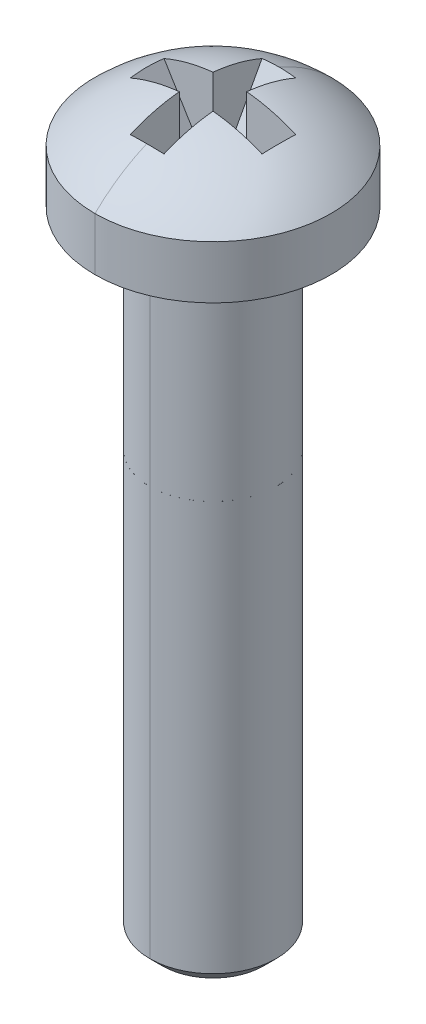
ISO-10303-21;
HEADER;
FILE_DESCRIPTION(('STEP AP214'),'2;1');
FILE_NAME('part.step','',(''),(''),'','','');
FILE_SCHEMA(('AUTOMOTIVE_DESIGN { 1 0 10303 214 1 1 1 1 }'));
ENDSEC;
DATA;
#1=APPLICATION_CONTEXT('core data for automotive mechanical design processes');
#2=APPLICATION_PROTOCOL_DEFINITION('international standard','automotive_design',2000,#1);
#3=PRODUCT_CONTEXT('',#1,'mechanical');
#4=PRODUCT('Part','Part','',(#3));
#5=PRODUCT_RELATED_PRODUCT_CATEGORY('part','',(#4));
#6=PRODUCT_DEFINITION_FORMATION('','',#4);
#7=PRODUCT_DEFINITION_CONTEXT('part definition',#1,'design');
#8=PRODUCT_DEFINITION('design','',#6,#7);
#9=PRODUCT_DEFINITION_SHAPE('','',#8);
#10=(LENGTH_UNIT() NAMED_UNIT(*) SI_UNIT(.MILLI.,.METRE.));
#11=(NAMED_UNIT(*) PLANE_ANGLE_UNIT() SI_UNIT($,.RADIAN.));
#12=(NAMED_UNIT(*) SI_UNIT($,.STERADIAN.) SOLID_ANGLE_UNIT());
#13=UNCERTAINTY_MEASURE_WITH_UNIT(LENGTH_MEASURE(1.E-05),#10,'distance_accuracy_value','');
#14=(GEOMETRIC_REPRESENTATION_CONTEXT(3) GLOBAL_UNCERTAINTY_ASSIGNED_CONTEXT((#13)) GLOBAL_UNIT_ASSIGNED_CONTEXT((#10,
#11,#12)) REPRESENTATION_CONTEXT('',''));
#15=CARTESIAN_POINT('',(0.,0.,0.));
#16=DIRECTION('',(0.,0.,1.));
#17=DIRECTION('',(1.,0.,0.));
#18=AXIS2_PLACEMENT_3D('',#15,#16,#17);
#19=CARTESIAN_POINT('',(0.,-15.,0.));
#20=DIRECTION('',(0.,-1.,0.));
#21=DIRECTION('',(0.,0.,-1.));
#22=AXIS2_PLACEMENT_3D('',#19,#20,#21);
#23=PLANE('',#22);
#24=CARTESIAN_POINT('',(0.,-15.,0.));
#25=DIRECTION('',(0.,-1.,0.));
#26=DIRECTION('',(0.,0.,-1.));
#27=AXIS2_PLACEMENT_3D('',#24,#25,#26);
#28=CIRCLE('',#27,1.2);
#29=CARTESIAN_POINT('',(0.,-15.,-1.2));
#30=VERTEX_POINT('',#29);
#31=CARTESIAN_POINT('',(0.,-15.,1.2));
#32=VERTEX_POINT('',#31);
#33=EDGE_CURVE('P0_E11',#30,#32,#28,.T.);
#34=ORIENTED_EDGE('',*,*,#33,.T.);
#35=CARTESIAN_POINT('',(0.,-15.,0.));
#36=DIRECTION('',(0.,1.,0.));
#37=DIRECTION('',(0.,0.,-1.));
#38=AXIS2_PLACEMENT_3D('',#35,#36,#37);
#39=CIRCLE('',#38,1.2);
#40=EDGE_CURVE('P0_E460',#30,#32,#39,.T.);
#41=ORIENTED_EDGE('',*,*,#40,.F.);
#42=EDGE_LOOP('',(#34,#41));
#43=FACE_BOUND('',#42,.T.);
#44=ADVANCED_FACE('P0_F17',(#43),#23,.T.);
#45=CARTESIAN_POINT('',(0.,-14.85,0.));
#46=DIRECTION('',(0.,1.,0.));
#47=DIRECTION('',(0.,0.,-1.));
#48=AXIS2_PLACEMENT_3D('',#45,#46,#47);
#49=CONICAL_SURFACE('',#48,1.35,0.7853981633973);
#50=CARTESIAN_POINT('',(0.,-14.7,0.));
#51=DIRECTION('',(0.,-1.,0.));
#52=DIRECTION('',(0.,0.,-1.));
#53=AXIS2_PLACEMENT_3D('',#50,#51,#52);
#54=CIRCLE('',#53,1.5);
#55=CARTESIAN_POINT('',(0.,-14.7,-1.5));
#56=VERTEX_POINT('',#55);
#57=CARTESIAN_POINT('',(0.,-14.7,1.5));
#58=VERTEX_POINT('',#57);
#59=EDGE_CURVE('P0_E414',#56,#58,#54,.T.);
#60=ORIENTED_EDGE('',*,*,#59,.T.);
#61=DIRECTION('',(0.,0.707106781186498,0.707106781186598));
#62=VECTOR('',#61,1.);
#63=CARTESIAN_POINT('',(0.,-15.,1.2));
#64=LINE('',#63,#62);
#65=EDGE_CURVE('P0_E463',#32,#58,#64,.T.);
#66=ORIENTED_EDGE('',*,*,#65,.F.);
#67=ORIENTED_EDGE('',*,*,#33,.F.);
#68=DIRECTION('',(0.,0.707106781186498,-0.707106781186598));
#69=VECTOR('',#68,1.);
#70=CARTESIAN_POINT('',(0.,-15.,-1.2));
#71=LINE('',#70,#69);
#72=EDGE_CURVE('P0_E20',#30,#56,#71,.T.);
#73=ORIENTED_EDGE('',*,*,#72,.T.);
#74=EDGE_LOOP('',(#60,#66,#67,#73));
#75=FACE_BOUND('',#74,.T.);
#76=ADVANCED_FACE('P0_F471',(#75),#49,.T.);
#77=CARTESIAN_POINT('',(0.,-14.85,0.));
#78=DIRECTION('',(0.,1.,0.));
#79=DIRECTION('',(0.,0.,-1.));
#80=AXIS2_PLACEMENT_3D('',#77,#78,#79);
#81=CONICAL_SURFACE('',#80,1.35,0.7853981633973);
#82=ORIENTED_EDGE('',*,*,#40,.T.);
#83=ORIENTED_EDGE('',*,*,#65,.T.);
#84=CARTESIAN_POINT('',(0.,-14.7,0.));
#85=DIRECTION('',(0.,1.,0.));
#86=DIRECTION('',(0.,0.,-1.));
#87=AXIS2_PLACEMENT_3D('',#84,#85,#86);
#88=CIRCLE('',#87,1.5);
#89=EDGE_CURVE('P0_E456',#56,#58,#88,.T.);
#90=ORIENTED_EDGE('',*,*,#89,.F.);
#91=ORIENTED_EDGE('',*,*,#72,.F.);
#92=EDGE_LOOP('',(#82,#83,#90,#91));
#93=FACE_BOUND('',#92,.T.);
#94=ADVANCED_FACE('P0_F475',(#93),#81,.T.);
#95=CARTESIAN_POINT('',(0.,3.27,0.));
#96=DIRECTION('',(0.,-1.,0.));
#97=DIRECTION('',(0.,0.,1.));
#98=AXIS2_PLACEMENT_3D('',#95,#96,#97);
#99=CYLINDRICAL_SURFACE('',#98,1.5);
#100=ORIENTED_EDGE('',*,*,#89,.T.);
#101=DIRECTION('',(0.,1.,0.));
#102=VECTOR('',#101,1.);
#103=CARTESIAN_POINT('',(0.,-14.7,1.5));
#104=LINE('',#103,#102);
#105=CARTESIAN_POINT('',(0.,0.,1.5));
#106=VERTEX_POINT('',#105);
#107=EDGE_CURVE('P0_E419',#58,#106,#104,.T.);
#108=ORIENTED_EDGE('',*,*,#107,.T.);
#109=CARTESIAN_POINT('',(0.,0.,0.));
#110=DIRECTION('',(0.,1.,0.));
#111=DIRECTION('',(0.,0.,-1.));
#112=AXIS2_PLACEMENT_3D('',#109,#110,#111);
#113=CIRCLE('',#112,1.5);
#114=CARTESIAN_POINT('',(0.,0.,-1.5));
#115=VERTEX_POINT('',#114);
#116=EDGE_CURVE('P0_E438',#115,#106,#113,.T.);
#117=ORIENTED_EDGE('',*,*,#116,.F.);
#118=DIRECTION('',(0.,1.,0.));
#119=VECTOR('',#118,1.);
#120=CARTESIAN_POINT('',(0.,-14.7,-1.5));
#121=LINE('',#120,#119);
#122=EDGE_CURVE('P0_E418',#56,#115,#121,.T.);
#123=ORIENTED_EDGE('',*,*,#122,.F.);
#124=EDGE_LOOP('',(#100,#108,#117,#123));
#125=FACE_BOUND('',#124,.T.);
#126=ADVANCED_FACE('P0_F478',(#125),#99,.T.);
#127=CARTESIAN_POINT('',(0.,3.27,0.));
#128=DIRECTION('',(0.,-1.,0.));
#129=DIRECTION('',(0.,0.,1.));
#130=AXIS2_PLACEMENT_3D('',#127,#128,#129);
#131=CYLINDRICAL_SURFACE('',#130,1.5);
#132=CARTESIAN_POINT('',(0.,0.,0.));
#133=DIRECTION('',(0.,-1.,0.));
#134=DIRECTION('',(0.,0.,-1.));
#135=AXIS2_PLACEMENT_3D('',#132,#133,#134);
#136=CIRCLE('',#135,1.5);
#137=EDGE_CURVE('P0_E434',#115,#106,#136,.T.);
#138=ORIENTED_EDGE('',*,*,#137,.T.);
#139=ORIENTED_EDGE('',*,*,#107,.F.);
#140=ORIENTED_EDGE('',*,*,#59,.F.);
#141=ORIENTED_EDGE('',*,*,#122,.T.);
#142=EDGE_LOOP('',(#138,#139,#140,#141));
#143=FACE_BOUND('',#142,.T.);
#144=ADVANCED_FACE('P0_F481',(#143),#131,.T.);
#145=CARTESIAN_POINT('',(0.,0.,0.));
#146=DIRECTION('',(0.,-1.,0.));
#147=DIRECTION('',(0.,0.,-1.));
#148=AXIS2_PLACEMENT_3D('',#145,#146,#147);
#149=PLANE('',#148);
#150=ORIENTED_EDGE('',*,*,#116,.T.);
#151=ORIENTED_EDGE('',*,*,#137,.F.);
#152=EDGE_LOOP('',(#150,#151));
#153=FACE_BOUND('',#152,.T.);
#154=CARTESIAN_POINT('',(0.,0.,0.));
#155=DIRECTION('',(0.,-1.,0.));
#156=DIRECTION('',(0.,0.,-1.));
#157=AXIS2_PLACEMENT_3D('',#154,#155,#156);
#158=CIRCLE('',#157,2.8);
#159=CARTESIAN_POINT('',(0.,0.,-2.8));
#160=VERTEX_POINT('',#159);
#161=CARTESIAN_POINT('',(0.,0.,2.8));
#162=VERTEX_POINT('',#161);
#163=EDGE_CURVE('P0_E446',#160,#162,#158,.T.);
#164=ORIENTED_EDGE('',*,*,#163,.T.);
#165=CARTESIAN_POINT('',(0.,0.,0.));
#166=DIRECTION('',(0.,1.,0.));
#167=DIRECTION('',(0.,0.,-1.));
#168=AXIS2_PLACEMENT_3D('',#165,#166,#167);
#169=CIRCLE('',#168,2.8);
#170=EDGE_CURVE('P0_E347',#160,#162,#169,.T.);
#171=ORIENTED_EDGE('',*,*,#170,.F.);
#172=EDGE_LOOP('',(#164,#171));
#173=FACE_BOUND('',#172,.T.);
#174=ADVANCED_FACE('P0_F483',(#153,#173),#149,.T.);
#175=CARTESIAN_POINT('',(0.,3.27,0.));
#176=DIRECTION('',(0.,-1.,0.));
#177=DIRECTION('',(0.,0.,1.));
#178=AXIS2_PLACEMENT_3D('',#175,#176,#177);
#179=CYLINDRICAL_SURFACE('',#178,2.8);
#180=CARTESIAN_POINT('',(0.,1.256571371417,0.));
#181=DIRECTION('',(0.,-1.,0.));
#182=DIRECTION('',(0.,0.,-1.));
#183=AXIS2_PLACEMENT_3D('',#180,#181,#182);
#184=CIRCLE('',#183,2.8);
#185=CARTESIAN_POINT('',(0.,1.256571371417,-2.8));
#186=VERTEX_POINT('',#185);
#187=CARTESIAN_POINT('',(0.,1.256571371417,2.8));
#188=VERTEX_POINT('',#187);
#189=EDGE_CURVE('P0_E241',#186,#188,#184,.T.);
#190=ORIENTED_EDGE('',*,*,#189,.T.);
#191=DIRECTION('',(0.,1.,0.));
#192=VECTOR('',#191,1.);
#193=CARTESIAN_POINT('',(0.,0.,2.8));
#194=LINE('',#193,#192);
#195=EDGE_CURVE('P0_E343',#162,#188,#194,.T.);
#196=ORIENTED_EDGE('',*,*,#195,.F.);
#197=ORIENTED_EDGE('',*,*,#163,.F.);
#198=DIRECTION('',(0.,1.,0.));
#199=VECTOR('',#198,1.);
#200=CARTESIAN_POINT('',(0.,0.,-2.8));
#201=LINE('',#200,#199);
#202=EDGE_CURVE('P0_E346',#160,#186,#201,.T.);
#203=ORIENTED_EDGE('',*,*,#202,.T.);
#204=EDGE_LOOP('',(#190,#196,#197,#203));
#205=FACE_BOUND('',#204,.T.);
#206=ADVANCED_FACE('P0_F486',(#205),#179,.T.);
#207=CARTESIAN_POINT('',(0.,3.27,0.));
#208=DIRECTION('',(0.,-1.,0.));
#209=DIRECTION('',(0.,0.,1.));
#210=AXIS2_PLACEMENT_3D('',#207,#208,#209);
#211=CYLINDRICAL_SURFACE('',#210,2.8);
#212=ORIENTED_EDGE('',*,*,#170,.T.);
#213=ORIENTED_EDGE('',*,*,#195,.T.);
#214=CARTESIAN_POINT('',(0.,1.256571371417,0.));
#215=DIRECTION('',(0.,1.,0.));
#216=DIRECTION('',(0.,0.,-1.));
#217=AXIS2_PLACEMENT_3D('',#214,#215,#216);
#218=CIRCLE('',#217,2.8);
#219=EDGE_CURVE('P0_E267',#186,#188,#218,.T.);
#220=ORIENTED_EDGE('',*,*,#219,.F.);
#221=ORIENTED_EDGE('',*,*,#202,.F.);
#222=EDGE_LOOP('',(#212,#213,#220,#221));
#223=FACE_BOUND('',#222,.T.);
#224=ADVANCED_FACE('P0_F496',(#223),#211,.T.);
#225=CARTESIAN_POINT('',(0.,0.,0.4));
#226=DIRECTION('',(0.,0.,1.));
#227=DIRECTION('',(1.,0.,0.));
#228=AXIS2_PLACEMENT_3D('',#225,#226,#227);
#229=PLANE('',#228);
#230=DIRECTION('',(0.,-1.,0.));
#231=VECTOR('',#230,1.);
#232=CARTESIAN_POINT('',(-0.4,2.359797974645,0.4));
#233=LINE('',#232,#231);
#234=CARTESIAN_POINT('',(-0.4,2.359797974645,0.4));
#235=VERTEX_POINT('',#234);
#236=CARTESIAN_POINT('',(-0.4,0.1594760794726,0.4));
#237=VERTEX_POINT('',#236);
#238=EDGE_CURVE('P0_E294',#235,#237,#233,.T.);
#239=ORIENTED_EDGE('',*,*,#238,.T.);
#240=DIRECTION('',(0.521313752334012,-0.853365086951319,0.));
#241=VECTOR('',#240,1.);
#242=CARTESIAN_POINT('',(-1.561519847402,2.060827196983,0.4));
#243=LINE('',#242,#241);
#244=CARTESIAN_POINT('',(-1.561519847402,2.060827196983,0.4));
#245=VERTEX_POINT('',#244);
#246=EDGE_CURVE('P0_E318',#245,#237,#243,.T.);
#247=ORIENTED_EDGE('',*,*,#246,.F.);
#248=CARTESIAN_POINT('',(0.,-1.6,0.4));
#249=DIRECTION('',(0.,0.,1.));
#250=DIRECTION('',(-0.100503781525898,0.994936676326184,0.));
#251=AXIS2_PLACEMENT_3D('',#248,#249,#250);
#252=CIRCLE('',#251,3.979949748426);
#253=EDGE_CURVE('P0_E387',#235,#245,#252,.T.);
#254=ORIENTED_EDGE('',*,*,#253,.F.);
#255=EDGE_LOOP('',(#239,#247,#254));
#256=FACE_BOUND('',#255,.T.);
#257=ADVANCED_FACE('P0_F512',(#256),#229,.F.);
#258=CARTESIAN_POINT('',(0.,0.,0.4));
#259=DIRECTION('',(0.,0.,1.));
#260=DIRECTION('',(1.,0.,0.));
#261=AXIS2_PLACEMENT_3D('',#258,#259,#260);
#262=PLANE('',#261);
#263=DIRECTION('',(1.,0.,0.));
#264=VECTOR('',#263,1.);
#265=CARTESIAN_POINT('',(-0.241488185187,-0.1,0.4));
#266=LINE('',#265,#264);
#267=CARTESIAN_POINT('',(-0.241488185187,-0.1,0.4));
#268=VERTEX_POINT('',#267);
#269=CARTESIAN_POINT('',(0.3855408748608,-0.1,0.4));
#270=VERTEX_POINT('',#269);
#271=EDGE_CURVE('P0_E431',#268,#270,#266,.T.);
#272=ORIENTED_EDGE('',*,*,#271,.F.);
#273=DIRECTION('',(0.521313752334012,-0.853365086951319,0.));
#274=VECTOR('',#273,1.);
#275=CARTESIAN_POINT('',(-0.4,0.1594760794726,0.4));
#276=LINE('',#275,#274);
#277=EDGE_CURVE('P0_E394',#237,#268,#276,.T.);
#278=ORIENTED_EDGE('',*,*,#277,.F.);
#279=DIRECTION('',(1.,0.,0.));
#280=VECTOR('',#279,1.);
#281=CARTESIAN_POINT('',(-0.4,0.1594760794726,0.4));
#282=LINE('',#281,#280);
#283=CARTESIAN_POINT('',(0.4,0.1594760794726,0.4));
#284=VERTEX_POINT('',#283);
#285=EDGE_CURVE('P0_E348',#237,#284,#282,.T.);
#286=ORIENTED_EDGE('',*,*,#285,.T.);
#287=DIRECTION('',(0.,-1.,0.));
#288=VECTOR('',#287,1.);
#289=CARTESIAN_POINT('',(0.4,2.359797974645,0.4));
#290=LINE('',#289,#288);
#291=CARTESIAN_POINT('',(0.4,2.359797974645,0.4));
#292=VERTEX_POINT('',#291);
#293=EDGE_CURVE('P0_E303',#292,#284,#290,.T.);
#294=ORIENTED_EDGE('',*,*,#293,.F.);
#295=CARTESIAN_POINT('',(0.,-1.6,0.4));
#296=DIRECTION('',(0.,0.,1.));
#297=DIRECTION('',(0.392579766011815,0.919717960745634,0.));
#298=AXIS2_PLACEMENT_3D('',#295,#296,#297);
#299=CIRCLE('',#298,3.979949748426);
#300=CARTESIAN_POINT('',(1.562447740976,2.060431266493,0.4));
#301=VERTEX_POINT('',#300);
#302=EDGE_CURVE('P0_E230',#301,#292,#299,.T.);
#303=ORIENTED_EDGE('',*,*,#302,.F.);
#304=DIRECTION('',(0.478378967835591,0.878153496339083,0.));
#305=VECTOR('',#304,1.);
#306=CARTESIAN_POINT('',(0.3855408748608,-0.1,0.4));
#307=LINE('',#306,#305);
#308=EDGE_CURVE('P0_E225',#270,#301,#307,.T.);
#309=ORIENTED_EDGE('',*,*,#308,.F.);
#310=EDGE_LOOP('',(#272,#278,#286,#294,#303,#309));
#311=FACE_BOUND('',#310,.T.);
#312=ADVANCED_FACE('P0_F566',(#311),#262,.F.);
#313=CARTESIAN_POINT('',(-0.4,2.078118441512,1.572082927268));
#314=DIRECTION('',(0.,-0.521313752334012,0.853365086951319));
#315=DIRECTION('',(-1.,0.,0.));
#316=AXIS2_PLACEMENT_3D('',#313,#314,#315);
#317=PLANE('',#316);
#318=DIRECTION('',(0.,-0.853365086951319,-0.521313752334012));
#319=VECTOR('',#318,1.);
#320=CARTESIAN_POINT('',(0.4,-0.07345758875551,0.2577027271379));
#321=LINE('',#320,#319);
#322=CARTESIAN_POINT('',(0.4,-0.07345758875551,0.2577027271379));
#323=VERTEX_POINT('',#322);
#324=CARTESIAN_POINT('',(0.4,-0.1,0.241488185187));
#325=VERTEX_POINT('',#324);
#326=EDGE_CURVE('P0_E322',#323,#325,#321,.T.);
#327=ORIENTED_EDGE('',*,*,#326,.T.);
#328=DIRECTION('',(1.,0.,0.));
#329=VECTOR('',#328,1.);
#330=CARTESIAN_POINT('',(0.3855408748608,-0.1,0.241488185187));
#331=LINE('',#330,#329);
#332=CARTESIAN_POINT('',(0.3855408748608,-0.1,0.241488185187));
#333=VERTEX_POINT('',#332);
#334=EDGE_CURVE('P0_E351',#333,#325,#331,.T.);
#335=ORIENTED_EDGE('',*,*,#334,.F.);
#336=DIRECTION('',(0.421551119413801,0.773835419800602,0.472729729108501));
#337=VECTOR('',#336,1.);
#338=CARTESIAN_POINT('',(0.3855408748608,-0.1,0.241488185187));
#339=LINE('',#338,#337);
#340=EDGE_CURVE('P0_E274',#333,#323,#339,.T.);
#341=ORIENTED_EDGE('',*,*,#340,.T.);
#342=EDGE_LOOP('',(#327,#335,#341));
#343=FACE_BOUND('',#342,.T.);
#344=ADVANCED_FACE('P0_F569',(#343),#317,.F.);
#345=CARTESIAN_POINT('',(-0.4,2.078118441512,1.572082927268));
#346=DIRECTION('',(0.,-0.521313752334012,0.853365086951319));
#347=DIRECTION('',(-1.,0.,0.));
#348=AXIS2_PLACEMENT_3D('',#345,#346,#347);
#349=PLANE('',#348);
#350=DIRECTION('',(1.,0.,0.));
#351=VECTOR('',#350,1.);
#352=CARTESIAN_POINT('',(-0.4,-0.1,0.241488185187));
#353=LINE('',#352,#351);
#354=CARTESIAN_POINT('',(-0.4,-0.1,0.241488185187));
#355=VERTEX_POINT('',#354);
#356=CARTESIAN_POINT('',(-0.241488185187,-0.1,0.241488185187));
#357=VERTEX_POINT('',#356);
#358=EDGE_CURVE('P0_E428',#355,#357,#353,.T.);
#359=ORIENTED_EDGE('',*,*,#358,.F.);
#360=DIRECTION('',(0.,-0.853365086951319,-0.521313752334012));
#361=VECTOR('',#360,1.);
#362=CARTESIAN_POINT('',(-0.4,0.1594760794726,0.4));
#363=LINE('',#362,#361);
#364=EDGE_CURVE('P0_E398',#237,#355,#363,.T.);
#365=ORIENTED_EDGE('',*,*,#364,.F.);
#366=DIRECTION('',(-0.462269489645205,0.756712519974609,0.462269489645205));
#367=VECTOR('',#366,1.);
#368=CARTESIAN_POINT('',(-0.241488185187,-0.1,0.241488185187));
#369=LINE('',#368,#367);
#370=EDGE_CURVE('P0_E406',#357,#237,#369,.T.);
#371=ORIENTED_EDGE('',*,*,#370,.F.);
#372=EDGE_LOOP('',(#359,#365,#371));
#373=FACE_BOUND('',#372,.T.);
#374=ADVANCED_FACE('P0_F571',(#373),#349,.F.);
#375=CARTESIAN_POINT('',(-0.4,2.078118441512,1.572082927268));
#376=DIRECTION('',(0.,-0.521313752334012,0.853365086951319));
#377=DIRECTION('',(-1.,0.,0.));
#378=AXIS2_PLACEMENT_3D('',#375,#376,#377);
#379=PLANE('',#378);
#380=DIRECTION('',(0.,-0.853365086951319,-0.521313752334012));
#381=VECTOR('',#380,1.);
#382=CARTESIAN_POINT('',(-0.4,2.060827196983,1.561519847402));
#383=LINE('',#382,#381);
#384=CARTESIAN_POINT('',(-0.4,2.060827196983,1.561519847402));
#385=VERTEX_POINT('',#384);
#386=EDGE_CURVE('P0_E290',#385,#237,#383,.T.);
#387=ORIENTED_EDGE('',*,*,#386,.F.);
#388=CARTESIAN_POINT('',(0.,-1.299779037149,-0.4914470161607));
#389=DIRECTION('',(0.,-0.521313752334012,0.853365086951319));
#390=DIRECTION('',(0.,0.853365086951319,0.521313752334012));
#391=AXIS2_PLACEMENT_3D('',#388,#389,#390);
#392=CIRCLE('',#391,3.958326313453);
#393=CARTESIAN_POINT('',(0.,2.078118441512,1.572082927268));
#394=VERTEX_POINT('',#393);
#395=EDGE_CURVE('P0_E262',#394,#385,#392,.T.);
#396=ORIENTED_EDGE('',*,*,#395,.F.);
#397=CARTESIAN_POINT('',(0.,-1.299779037149,-0.4914470161607));
#398=DIRECTION('',(0.,-0.521313752334015,0.853365086951317));
#399=DIRECTION('',(0.101052810790401,0.848996764796909,0.518645180056406));
#400=AXIS2_PLACEMENT_3D('',#397,#398,#399);
#401=CIRCLE('',#400,3.958326313453);
#402=CARTESIAN_POINT('',(0.4,2.060827196983,1.561519847402));
#403=VERTEX_POINT('',#402);
#404=EDGE_CURVE('P0_E261',#403,#394,#401,.T.);
#405=ORIENTED_EDGE('',*,*,#404,.F.);
#406=DIRECTION('',(0.,-0.853365086951319,-0.521313752334012));
#407=VECTOR('',#406,1.);
#408=CARTESIAN_POINT('',(0.4,2.060827196983,1.561519847402));
#409=LINE('',#408,#407);
#410=EDGE_CURVE('P0_E306',#403,#284,#409,.T.);
#411=ORIENTED_EDGE('',*,*,#410,.T.);
#412=ORIENTED_EDGE('',*,*,#285,.F.);
#413=EDGE_LOOP('',(#387,#396,#405,#411,#412));
#414=FACE_BOUND('',#413,.T.);
#415=ADVANCED_FACE('P0_F505',(#414),#379,.F.);
#416=CARTESIAN_POINT('',(-0.4,-0.1,0.241488185187));
#417=DIRECTION('',(0.,-1.,0.));
#418=DIRECTION('',(0.,0.,-1.));
#419=AXIS2_PLACEMENT_3D('',#416,#417,#418);
#420=PLANE('',#419);
#421=DIRECTION('',(0.,0.,-1.));
#422=VECTOR('',#421,1.);
#423=CARTESIAN_POINT('',(-0.4,-0.1,0.241488185187));
#424=LINE('',#423,#422);
#425=CARTESIAN_POINT('',(-0.4,-0.1,-0.3855408748608));
#426=VERTEX_POINT('',#425);
#427=EDGE_CURVE('P0_E295',#355,#426,#424,.T.);
#428=ORIENTED_EDGE('',*,*,#427,.F.);
#429=ORIENTED_EDGE('',*,*,#358,.T.);
#430=DIRECTION('',(0.,0.,1.));
#431=VECTOR('',#430,1.);
#432=CARTESIAN_POINT('',(-0.241488185187,-0.1,0.241488185187));
#433=LINE('',#432,#431);
#434=EDGE_CURVE('P0_E402',#357,#268,#433,.T.);
#435=ORIENTED_EDGE('',*,*,#434,.T.);
#436=ORIENTED_EDGE('',*,*,#271,.T.);
#437=DIRECTION('',(0.,0.,1.));
#438=VECTOR('',#437,1.);
#439=CARTESIAN_POINT('',(0.3855408748608,-0.1,0.241488185187));
#440=LINE('',#439,#438);
#441=EDGE_CURVE('P0_E277',#333,#270,#440,.T.);
#442=ORIENTED_EDGE('',*,*,#441,.F.);
#443=ORIENTED_EDGE('',*,*,#334,.T.);
#444=DIRECTION('',(0.,0.,-1.));
#445=VECTOR('',#444,1.);
#446=CARTESIAN_POINT('',(0.4,-0.1,0.241488185187));
#447=LINE('',#446,#445);
#448=CARTESIAN_POINT('',(0.4,-0.1,-0.3855408748608));
#449=VERTEX_POINT('',#448);
#450=EDGE_CURVE('P0_E302',#325,#449,#447,.T.);
#451=ORIENTED_EDGE('',*,*,#450,.T.);
#452=DIRECTION('',(1.,0.,0.));
#453=VECTOR('',#452,1.);
#454=CARTESIAN_POINT('',(0.3855408748608,-0.1,-0.3855408748608));
#455=LINE('',#454,#453);
#456=CARTESIAN_POINT('',(0.3855408748608,-0.1,-0.3855408748608));
#457=VERTEX_POINT('',#456);
#458=EDGE_CURVE('P0_E381',#457,#449,#455,.T.);
#459=ORIENTED_EDGE('',*,*,#458,.F.);
#460=DIRECTION('',(0.,0.,1.));
#461=VECTOR('',#460,1.);
#462=CARTESIAN_POINT('',(0.3855408748608,-0.1,-0.4));
#463=LINE('',#462,#461);
#464=CARTESIAN_POINT('',(0.3855408748608,-0.1,-0.4));
#465=VERTEX_POINT('',#464);
#466=EDGE_CURVE('P0_E355',#465,#457,#463,.T.);
#467=ORIENTED_EDGE('',*,*,#466,.F.);
#468=DIRECTION('',(1.,0.,0.));
#469=VECTOR('',#468,1.);
#470=CARTESIAN_POINT('',(-0.241488185187,-0.1,-0.4));
#471=LINE('',#470,#469);
#472=CARTESIAN_POINT('',(-0.241488185187,-0.1,-0.4));
#473=VERTEX_POINT('',#472);
#474=EDGE_CURVE('P0_E286',#473,#465,#471,.T.);
#475=ORIENTED_EDGE('',*,*,#474,.F.);
#476=DIRECTION('',(0.,0.,1.));
#477=VECTOR('',#476,1.);
#478=CARTESIAN_POINT('',(-0.241488185187,-0.1,-0.4));
#479=LINE('',#478,#477);
#480=CARTESIAN_POINT('',(-0.241488185187,-0.1,-0.3855408748608));
#481=VERTEX_POINT('',#480);
#482=EDGE_CURVE('P0_E374',#473,#481,#479,.T.);
#483=ORIENTED_EDGE('',*,*,#482,.T.);
#484=DIRECTION('',(1.,0.,0.));
#485=VECTOR('',#484,1.);
#486=CARTESIAN_POINT('',(-0.4,-0.1,-0.3855408748608));
#487=LINE('',#486,#485);
#488=EDGE_CURVE('P0_E370',#426,#481,#487,.T.);
#489=ORIENTED_EDGE('',*,*,#488,.F.);
#490=EDGE_LOOP('',(#428,#429,#435,#436,#442,#443,#451,#459,#467,#475,#483,#489));
#491=FACE_BOUND('',#490,.T.);
#492=ADVANCED_FACE('P0_F577',(#491),#420,.F.);
#493=CARTESIAN_POINT('',(-0.4,0.,0.));
#494=DIRECTION('',(1.,0.,0.));
#495=DIRECTION('',(0.,1.,0.));
#496=AXIS2_PLACEMENT_3D('',#493,#494,#495);
#497=PLANE('',#496);
#498=CARTESIAN_POINT('',(-0.4,-1.6,0.));
#499=DIRECTION('',(1.,0.,0.));
#500=DIRECTION('',(0.,0.994936676326184,0.100503781525898));
#501=AXIS2_PLACEMENT_3D('',#498,#499,#500);
#502=CIRCLE('',#501,3.979949748426);
#503=EDGE_CURVE('P0_E266',#235,#385,#502,.T.);
#504=ORIENTED_EDGE('',*,*,#503,.T.);
#505=ORIENTED_EDGE('',*,*,#386,.T.);
#506=ORIENTED_EDGE('',*,*,#238,.F.);
#507=EDGE_LOOP('',(#504,#505,#506));
#508=FACE_BOUND('',#507,.T.);
#509=ADVANCED_FACE('P0_F508',(#508),#497,.T.);
#510=CARTESIAN_POINT('',(-0.4,0.,0.));
#511=DIRECTION('',(1.,0.,0.));
#512=DIRECTION('',(0.,1.,0.));
#513=AXIS2_PLACEMENT_3D('',#510,#511,#512);
#514=PLANE('',#513);
#515=DIRECTION('',(0.,-1.,0.));
#516=VECTOR('',#515,1.);
#517=CARTESIAN_POINT('',(-0.4,2.359797974645,-0.4));
#518=LINE('',#517,#516);
#519=CARTESIAN_POINT('',(-0.4,2.359797974645,-0.4));
#520=VERTEX_POINT('',#519);
#521=CARTESIAN_POINT('',(-0.4,0.1594760794726,-0.4));
#522=VERTEX_POINT('',#521);
#523=EDGE_CURVE('P0_E257',#520,#522,#518,.T.);
#524=ORIENTED_EDGE('',*,*,#523,.T.);
#525=DIRECTION('',(0.,0.,1.));
#526=VECTOR('',#525,1.);
#527=CARTESIAN_POINT('',(-0.4,0.1594760794726,-0.4));
#528=LINE('',#527,#526);
#529=EDGE_CURVE('P0_E313',#522,#237,#528,.T.);
#530=ORIENTED_EDGE('',*,*,#529,.T.);
#531=ORIENTED_EDGE('',*,*,#364,.T.);
#532=ORIENTED_EDGE('',*,*,#427,.T.);
#533=DIRECTION('',(0.,0.878153496339083,-0.478378967835591));
#534=VECTOR('',#533,1.);
#535=CARTESIAN_POINT('',(-0.4,-0.1,-0.3855408748608));
#536=LINE('',#535,#534);
#537=CARTESIAN_POINT('',(-0.4,2.060431266493,-1.562447740976));
#538=VERTEX_POINT('',#537);
#539=EDGE_CURVE('P0_E366',#426,#538,#536,.T.);
#540=ORIENTED_EDGE('',*,*,#539,.T.);
#541=CARTESIAN_POINT('',(-0.4,-1.6,0.));
#542=DIRECTION('',(1.,0.,0.));
#543=DIRECTION('',(0.,0.919717960745634,-0.392579766011815));
#544=AXIS2_PLACEMENT_3D('',#541,#542,#543);
#545=CIRCLE('',#544,3.979949748426);
#546=EDGE_CURVE('P0_E395',#538,#520,#545,.T.);
#547=ORIENTED_EDGE('',*,*,#546,.T.);
#548=EDGE_LOOP('',(#524,#530,#531,#532,#540,#547));
#549=FACE_BOUND('',#548,.T.);
#550=ADVANCED_FACE('P0_F522',(#549),#514,.T.);
#551=CARTESIAN_POINT('',(0.,-1.6,0.));
#552=DIRECTION('',(0.,-1.,0.));
#553=DIRECTION('',(0.,0.,1.));
#554=AXIS2_PLACEMENT_3D('',#551,#552,#553);
#555=SPHERICAL_SURFACE('',#554,4.);
#556=CARTESIAN_POINT('',(0.,-1.418692273732,0.3328240253877));
#557=DIRECTION('',(0.,-0.478378967835579,-0.878153496339089));
#558=DIRECTION('',(-0.100451933816205,0.873711719002947,-0.475959285096426));
#559=AXIS2_PLACEMENT_3D('',#556,#557,#558);
#560=CIRCLE('',#559,3.982003977462);
#561=CARTESIAN_POINT('',(0.,2.078118441512,-1.572082927268));
#562=VERTEX_POINT('',#561);
#563=EDGE_CURVE('P0_E363',#538,#562,#560,.T.);
#564=ORIENTED_EDGE('',*,*,#563,.T.);
#565=CARTESIAN_POINT('',(0.,-1.6,0.));
#566=DIRECTION('',(1.,0.,0.));
#567=DIRECTION('',(0.,0.714142842854292,-0.7));
#568=AXIS2_PLACEMENT_3D('',#565,#566,#567);
#569=CIRCLE('',#568,4.);
#570=EDGE_CURVE('P0_E245',#186,#562,#569,.T.);
#571=ORIENTED_EDGE('',*,*,#570,.F.);
#572=ORIENTED_EDGE('',*,*,#219,.T.);
#573=CARTESIAN_POINT('',(0.,-1.6,0.));
#574=DIRECTION('',(-1.,0.,0.));
#575=DIRECTION('',(0.,0.714142842854292,0.7));
#576=AXIS2_PLACEMENT_3D('',#573,#574,#575);
#577=CIRCLE('',#576,4.);
#578=EDGE_CURVE('P0_E246',#188,#394,#577,.T.);
#579=ORIENTED_EDGE('',*,*,#578,.T.);
#580=ORIENTED_EDGE('',*,*,#395,.T.);
#581=ORIENTED_EDGE('',*,*,#503,.F.);
#582=ORIENTED_EDGE('',*,*,#253,.T.);
#583=CARTESIAN_POINT('',(0.4914470161607,-1.299779037149,0.));
#584=DIRECTION('',(0.853365086951317,0.521313752334015,0.));
#585=DIRECTION('',(-0.518645180056406,0.848996764796909,-0.101052810790401));
#586=AXIS2_PLACEMENT_3D('',#583,#584,#585);
#587=CIRCLE('',#586,3.958326313453);
#588=CARTESIAN_POINT('',(-1.561519847402,2.060827196983,-0.4));
#589=VERTEX_POINT('',#588);
#590=EDGE_CURVE('P0_E317',#589,#245,#587,.T.);
#591=ORIENTED_EDGE('',*,*,#590,.F.);
#592=CARTESIAN_POINT('',(0.,-1.6,-0.4));
#593=DIRECTION('',(0.,0.,1.));
#594=DIRECTION('',(-0.100503781525898,0.994936676326184,0.));
#595=AXIS2_PLACEMENT_3D('',#592,#593,#594);
#596=CIRCLE('',#595,3.979949748426);
#597=EDGE_CURVE('P0_E342',#520,#589,#596,.T.);
#598=ORIENTED_EDGE('',*,*,#597,.F.);
#599=ORIENTED_EDGE('',*,*,#546,.F.);
#600=EDGE_LOOP('',(#564,#571,#572,#579,#580,#581,#582,#591,#598,#599));
#601=FACE_BOUND('',#600,.T.);
#602=ADVANCED_FACE('P0_F499',(#601),#555,.T.);
#603=CARTESIAN_POINT('',(-1.572082927268,2.078118441512,-0.4));
#604=DIRECTION('',(-0.853365086951319,-0.521313752334012,0.));
#605=DIRECTION('',(-0.521313752334012,0.853365086951319,0.));
#606=AXIS2_PLACEMENT_3D('',#603,#604,#605);
#607=PLANE('',#606);
#608=ORIENTED_EDGE('',*,*,#482,.F.);
#609=DIRECTION('',(0.521313752334012,-0.853365086951319,0.));
#610=VECTOR('',#609,1.);
#611=CARTESIAN_POINT('',(-0.2577027271379,-0.07345758875551,-0.4));
#612=LINE('',#611,#610);
#613=CARTESIAN_POINT('',(-0.2577027271379,-0.07345758875551,-0.4));
#614=VERTEX_POINT('',#613);
#615=EDGE_CURVE('P0_E282',#614,#473,#612,.T.);
#616=ORIENTED_EDGE('',*,*,#615,.F.);
#617=DIRECTION('',(-0.472729729108501,0.773835419800602,-0.421551119413801));
#618=VECTOR('',#617,1.);
#619=CARTESIAN_POINT('',(-0.241488185187,-0.1,-0.3855408748608));
#620=LINE('',#619,#618);
#621=EDGE_CURVE('P0_E378',#481,#614,#620,.T.);
#622=ORIENTED_EDGE('',*,*,#621,.F.);
#623=EDGE_LOOP('',(#608,#616,#622));
#624=FACE_BOUND('',#623,.T.);
#625=ADVANCED_FACE('P0_F585',(#624),#607,.F.);
#626=CARTESIAN_POINT('',(-1.572082927268,2.078118441512,-0.4));
#627=DIRECTION('',(-0.853365086951319,-0.521313752334012,0.));
#628=DIRECTION('',(-0.521313752334012,0.853365086951319,0.));
#629=AXIS2_PLACEMENT_3D('',#626,#627,#628);
#630=PLANE('',#629);
#631=ORIENTED_EDGE('',*,*,#277,.T.);
#632=ORIENTED_EDGE('',*,*,#434,.F.);
#633=ORIENTED_EDGE('',*,*,#370,.T.);
#634=EDGE_LOOP('',(#631,#632,#633));
#635=FACE_BOUND('',#634,.T.);
#636=ADVANCED_FACE('P0_F588',(#635),#630,.F.);
#637=CARTESIAN_POINT('',(-1.572082927268,2.078118441512,-0.4));
#638=DIRECTION('',(-0.853365086951319,-0.521313752334012,0.));
#639=DIRECTION('',(-0.521313752334012,0.853365086951319,0.));
#640=AXIS2_PLACEMENT_3D('',#637,#638,#639);
#641=PLANE('',#640);
#642=ORIENTED_EDGE('',*,*,#246,.T.);
#643=ORIENTED_EDGE('',*,*,#529,.F.);
#644=DIRECTION('',(0.521313752334012,-0.853365086951319,0.));
#645=VECTOR('',#644,1.);
#646=CARTESIAN_POINT('',(-1.561519847402,2.060827196983,-0.4));
#647=LINE('',#646,#645);
#648=EDGE_CURVE('P0_E217',#589,#522,#647,.T.);
#649=ORIENTED_EDGE('',*,*,#648,.F.);
#650=ORIENTED_EDGE('',*,*,#590,.T.);
#651=EDGE_LOOP('',(#642,#643,#649,#650));
#652=FACE_BOUND('',#651,.T.);
#653=ADVANCED_FACE('P0_F516',(#652),#641,.F.);
#654=CARTESIAN_POINT('',(-0.4,-0.1,-0.3855408748608));
#655=DIRECTION('',(0.,-0.478378967835591,-0.878153496339083));
#656=DIRECTION('',(0.,-0.878153496339083,0.478378967835591));
#657=AXIS2_PLACEMENT_3D('',#654,#655,#656);
#658=PLANE('',#657);
#659=ORIENTED_EDGE('',*,*,#458,.T.);
#660=DIRECTION('',(0.,0.878153496339083,-0.478378967835591));
#661=VECTOR('',#660,1.);
#662=CARTESIAN_POINT('',(0.4,-0.1,-0.3855408748608));
#663=LINE('',#662,#661);
#664=CARTESIAN_POINT('',(0.4,-0.07345758875551,-0.4));
#665=VERTEX_POINT('',#664);
#666=EDGE_CURVE('P0_E298',#449,#665,#663,.T.);
#667=ORIENTED_EDGE('',*,*,#666,.T.);
#668=DIRECTION('',(0.431542198894386,0.792175902907174,-0.431542198894386));
#669=VECTOR('',#668,1.);
#670=CARTESIAN_POINT('',(0.3855408748608,-0.1,-0.3855408748608));
#671=LINE('',#670,#669);
#672=EDGE_CURVE('P0_E278',#457,#665,#671,.T.);
#673=ORIENTED_EDGE('',*,*,#672,.F.);
#674=EDGE_LOOP('',(#659,#667,#673));
#675=FACE_BOUND('',#674,.T.);
#676=ADVANCED_FACE('P0_F594',(#675),#658,.F.);
#677=CARTESIAN_POINT('',(-0.4,-0.1,-0.3855408748608));
#678=DIRECTION('',(0.,-0.478378967835591,-0.878153496339083));
#679=DIRECTION('',(0.,-0.878153496339083,0.478378967835591));
#680=AXIS2_PLACEMENT_3D('',#677,#678,#679);
#681=PLANE('',#680);
#682=DIRECTION('',(0.,0.878153496339083,-0.47837896783559));
#683=VECTOR('',#682,1.);
#684=CARTESIAN_POINT('',(0.4,-0.07345758875551,-0.4));
#685=LINE('',#684,#683);
#686=CARTESIAN_POINT('',(0.4,2.060431266493,-1.562447740976));
#687=VERTEX_POINT('',#686);
#688=EDGE_CURVE('P0_E249',#665,#687,#685,.T.);
#689=ORIENTED_EDGE('',*,*,#688,.T.);
#690=CARTESIAN_POINT('',(0.,-1.418692273732,0.3328240253877));
#691=DIRECTION('',(0.,-0.478378967835591,-0.878153496339083));
#692=DIRECTION('',(0.,0.878153496339083,-0.478378967835591));
#693=AXIS2_PLACEMENT_3D('',#690,#691,#692);
#694=CIRCLE('',#693,3.982003977462);
#695=EDGE_CURVE('P0_E250',#562,#687,#694,.T.);
#696=ORIENTED_EDGE('',*,*,#695,.F.);
#697=ORIENTED_EDGE('',*,*,#563,.F.);
#698=ORIENTED_EDGE('',*,*,#539,.F.);
#699=ORIENTED_EDGE('',*,*,#488,.T.);
#700=ORIENTED_EDGE('',*,*,#621,.T.);
#701=DIRECTION('',(1.,0.,0.));
#702=VECTOR('',#701,1.);
#703=CARTESIAN_POINT('',(-0.2577027271379,-0.07345758875551,-0.4));
#704=LINE('',#703,#702);
#705=EDGE_CURVE('P0_E287',#614,#665,#704,.T.);
#706=ORIENTED_EDGE('',*,*,#705,.T.);
#707=EDGE_LOOP('',(#689,#696,#697,#698,#699,#700,#706));
#708=FACE_BOUND('',#707,.T.);
#709=ADVANCED_FACE('P0_F526',(#708),#681,.F.);
#710=CARTESIAN_POINT('',(0.3855408748608,-0.1,-0.4));
#711=DIRECTION('',(0.878153496339083,-0.478378967835591,0.));
#712=DIRECTION('',(0.,0.,-1.));
#713=AXIS2_PLACEMENT_3D('',#710,#711,#712);
#714=PLANE('',#713);
#715=CARTESIAN_POINT('',(-0.3328240253877,-1.418692273732,0.));
#716=DIRECTION('',(-0.878153496339089,0.478378967835579,0.));
#717=DIRECTION('',(0.475959285096426,0.873711719002947,0.100451933816205));
#718=AXIS2_PLACEMENT_3D('',#715,#716,#717);
#719=CIRCLE('',#718,3.982003977462);
#720=CARTESIAN_POINT('',(1.562447740976,2.060431266493,-0.4));
#721=VERTEX_POINT('',#720);
#722=EDGE_CURVE('P0_E221',#301,#721,#719,.T.);
#723=ORIENTED_EDGE('',*,*,#722,.T.);
#724=DIRECTION('',(0.47837896783559,0.878153496339083,0.));
#725=VECTOR('',#724,1.);
#726=CARTESIAN_POINT('',(0.4,-0.07345758875551,-0.4));
#727=LINE('',#726,#725);
#728=EDGE_CURVE('P0_E206',#665,#721,#727,.T.);
#729=ORIENTED_EDGE('',*,*,#728,.F.);
#730=DIRECTION('',(0.,0.,1.));
#731=VECTOR('',#730,1.);
#732=CARTESIAN_POINT('',(0.4,-0.07345758875551,-0.4));
#733=LINE('',#732,#731);
#734=EDGE_CURVE('P0_E326',#665,#323,#733,.T.);
#735=ORIENTED_EDGE('',*,*,#734,.T.);
#736=ORIENTED_EDGE('',*,*,#340,.F.);
#737=ORIENTED_EDGE('',*,*,#441,.T.);
#738=ORIENTED_EDGE('',*,*,#308,.T.);
#739=EDGE_LOOP('',(#723,#729,#735,#736,#737,#738));
#740=FACE_BOUND('',#739,.T.);
#741=ADVANCED_FACE('P0_F222',(#740),#714,.F.);
#742=CARTESIAN_POINT('',(0.3855408748608,-0.1,-0.4));
#743=DIRECTION('',(0.878153496339083,-0.478378967835591,0.));
#744=DIRECTION('',(0.,0.,-1.));
#745=AXIS2_PLACEMENT_3D('',#742,#743,#744);
#746=PLANE('',#745);
#747=ORIENTED_EDGE('',*,*,#466,.T.);
#748=ORIENTED_EDGE('',*,*,#672,.T.);
#749=DIRECTION('',(0.478378967835591,0.878153496339083,0.));
#750=VECTOR('',#749,1.);
#751=CARTESIAN_POINT('',(0.3855408748608,-0.1,-0.4));
#752=LINE('',#751,#750);
#753=EDGE_CURVE('P0_E218',#465,#665,#752,.T.);
#754=ORIENTED_EDGE('',*,*,#753,.F.);
#755=EDGE_LOOP('',(#747,#748,#754));
#756=FACE_BOUND('',#755,.T.);
#757=ADVANCED_FACE('P0_F608',(#756),#746,.F.);
#758=CARTESIAN_POINT('',(0.,0.,-0.4));
#759=DIRECTION('',(0.,0.,1.));
#760=DIRECTION('',(1.,0.,0.));
#761=AXIS2_PLACEMENT_3D('',#758,#759,#760);
#762=PLANE('',#761);
#763=ORIENTED_EDGE('',*,*,#648,.T.);
#764=ORIENTED_EDGE('',*,*,#523,.F.);
#765=ORIENTED_EDGE('',*,*,#597,.T.);
#766=EDGE_LOOP('',(#763,#764,#765));
#767=FACE_BOUND('',#766,.T.);
#768=ADVANCED_FACE('P0_F519',(#767),#762,.T.);
#769=CARTESIAN_POINT('',(0.,0.,-0.4));
#770=DIRECTION('',(0.,0.,1.));
#771=DIRECTION('',(1.,0.,0.));
#772=AXIS2_PLACEMENT_3D('',#769,#770,#771);
#773=PLANE('',#772);
#774=DIRECTION('',(0.,-1.,0.));
#775=VECTOR('',#774,1.);
#776=CARTESIAN_POINT('',(0.4,2.359797974645,-0.4));
#777=LINE('',#776,#775);
#778=CARTESIAN_POINT('',(0.4,2.359797974645,-0.4));
#779=VERTEX_POINT('',#778);
#780=EDGE_CURVE('P0_E211',#779,#665,#777,.T.);
#781=ORIENTED_EDGE('',*,*,#780,.T.);
#782=ORIENTED_EDGE('',*,*,#728,.T.);
#783=CARTESIAN_POINT('',(0.,-1.6,-0.4));
#784=DIRECTION('',(0.,0.,1.));
#785=DIRECTION('',(0.392579766011815,0.919717960745634,0.));
#786=AXIS2_PLACEMENT_3D('',#783,#784,#785);
#787=CIRCLE('',#786,3.979949748426);
#788=EDGE_CURVE('P0_E210',#721,#779,#787,.T.);
#789=ORIENTED_EDGE('',*,*,#788,.T.);
#790=EDGE_LOOP('',(#781,#782,#789));
#791=FACE_BOUND('',#790,.T.);
#792=ADVANCED_FACE('P0_F208',(#791),#773,.T.);
#793=CARTESIAN_POINT('',(0.,0.,-0.4));
#794=DIRECTION('',(0.,0.,1.));
#795=DIRECTION('',(1.,0.,0.));
#796=AXIS2_PLACEMENT_3D('',#793,#794,#795);
#797=PLANE('',#796);
#798=ORIENTED_EDGE('',*,*,#705,.F.);
#799=ORIENTED_EDGE('',*,*,#615,.T.);
#800=ORIENTED_EDGE('',*,*,#474,.T.);
#801=ORIENTED_EDGE('',*,*,#753,.T.);
#802=EDGE_LOOP('',(#798,#799,#800,#801));
#803=FACE_BOUND('',#802,.T.);
#804=ADVANCED_FACE('P0_F614',(#803),#797,.T.);
#805=CARTESIAN_POINT('',(0.4,0.,0.));
#806=DIRECTION('',(1.,0.,0.));
#807=DIRECTION('',(0.,1.,0.));
#808=AXIS2_PLACEMENT_3D('',#805,#806,#807);
#809=PLANE('',#808);
#810=ORIENTED_EDGE('',*,*,#666,.F.);
#811=ORIENTED_EDGE('',*,*,#450,.F.);
#812=ORIENTED_EDGE('',*,*,#326,.F.);
#813=ORIENTED_EDGE('',*,*,#734,.F.);
#814=EDGE_LOOP('',(#810,#811,#812,#813));
#815=FACE_BOUND('',#814,.T.);
#816=ADVANCED_FACE('P0_F541',(#815),#809,.F.);
#817=CARTESIAN_POINT('',(0.4,0.,0.));
#818=DIRECTION('',(1.,0.,0.));
#819=DIRECTION('',(0.,1.,0.));
#820=AXIS2_PLACEMENT_3D('',#817,#818,#819);
#821=PLANE('',#820);
#822=ORIENTED_EDGE('',*,*,#410,.F.);
#823=CARTESIAN_POINT('',(0.4,-1.6,0.));
#824=DIRECTION('',(1.,0.,0.));
#825=DIRECTION('',(0.,0.994936676326184,0.100503781525898));
#826=AXIS2_PLACEMENT_3D('',#823,#824,#825);
#827=CIRCLE('',#826,3.979949748426);
#828=EDGE_CURVE('P0_E253',#292,#403,#827,.T.);
#829=ORIENTED_EDGE('',*,*,#828,.F.);
#830=ORIENTED_EDGE('',*,*,#293,.T.);
#831=EDGE_LOOP('',(#822,#829,#830));
#832=FACE_BOUND('',#831,.T.);
#833=ADVANCED_FACE('P0_F532',(#832),#821,.F.);
#834=CARTESIAN_POINT('',(0.4,0.,0.));
#835=DIRECTION('',(1.,0.,0.));
#836=DIRECTION('',(0.,1.,0.));
#837=AXIS2_PLACEMENT_3D('',#834,#835,#836);
#838=PLANE('',#837);
#839=ORIENTED_EDGE('',*,*,#688,.F.);
#840=ORIENTED_EDGE('',*,*,#780,.F.);
#841=CARTESIAN_POINT('',(0.4,-1.6,0.));
#842=DIRECTION('',(1.,0.,0.));
#843=DIRECTION('',(0.,0.919717960745634,-0.392579766011815));
#844=AXIS2_PLACEMENT_3D('',#841,#842,#843);
#845=CIRCLE('',#844,3.979949748426);
#846=EDGE_CURVE('P0_E236',#687,#779,#845,.T.);
#847=ORIENTED_EDGE('',*,*,#846,.F.);
#848=EDGE_LOOP('',(#839,#840,#847));
#849=FACE_BOUND('',#848,.T.);
#850=ADVANCED_FACE('P0_F530',(#849),#838,.F.);
#851=CARTESIAN_POINT('',(0.,-1.6,0.));
#852=DIRECTION('',(0.,-1.,0.));
#853=DIRECTION('',(0.,0.,1.));
#854=AXIS2_PLACEMENT_3D('',#851,#852,#853);
#855=SPHERICAL_SURFACE('',#854,4.);
#856=ORIENTED_EDGE('',*,*,#788,.F.);
#857=ORIENTED_EDGE('',*,*,#722,.F.);
#858=ORIENTED_EDGE('',*,*,#302,.T.);
#859=ORIENTED_EDGE('',*,*,#828,.T.);
#860=ORIENTED_EDGE('',*,*,#404,.T.);
#861=ORIENTED_EDGE('',*,*,#578,.F.);
#862=ORIENTED_EDGE('',*,*,#189,.F.);
#863=ORIENTED_EDGE('',*,*,#570,.T.);
#864=ORIENTED_EDGE('',*,*,#695,.T.);
#865=ORIENTED_EDGE('',*,*,#846,.T.);
#866=EDGE_LOOP('',(#856,#857,#858,#859,#860,#861,#862,#863,#864,#865));
#867=FACE_BOUND('',#866,.T.);
#868=ADVANCED_FACE('P0_F233',(#867),#855,.T.);
#869=CLOSED_SHELL('',(#44,#76,#94,#126,#144,#174,#206,#224,#257,#312,#344,#374,#415,#492,#509,
#550,#602,#625,#636,#653,#676,#709,#741,#757,#768,#792,#804,#816,#833,#850,#868));
#870=MANIFOLD_SOLID_BREP('P0_B1',#869);
#871=CARTESIAN_POINT('',(0.,-15.,0.));
#872=DIRECTION('',(0.,-1.,0.));
#873=DIRECTION('',(1.,0.,0.));
#874=AXIS2_PLACEMENT_3D('',#871,#872,#873);
#875=CYLINDRICAL_SURFACE('',#874,1.);
#876=CARTESIAN_POINT('',(1.,-5.,0.));
#877=DIRECTION('',(0.,-1.,0.));
#878=VECTOR('',#877,1.);
#879=LINE('',#876,#878);
#880=CARTESIAN_POINT('',(1.,-5.,0.));
#881=VERTEX_POINT('',#880);
#882=CARTESIAN_POINT('',(1.,-15.,0.));
#883=VERTEX_POINT('',#882);
#884=EDGE_CURVE('P1_E28',#881,#883,#879,.T.);
#885=ORIENTED_EDGE('',*,*,#884,.T.);
#886=CARTESIAN_POINT('',(0.,-15.,0.));
#887=DIRECTION('',(0.,1.,0.));
#888=DIRECTION('',(1.,0.,0.));
#889=AXIS2_PLACEMENT_3D('',#886,#887,#888);
#890=CIRCLE('',#889,1.);
#891=CARTESIAN_POINT('',(-1.,-15.,0.));
#892=VERTEX_POINT('',#891);
#893=EDGE_CURVE('P1_E11',#883,#892,#890,.T.);
#894=ORIENTED_EDGE('',*,*,#893,.T.);
#895=CARTESIAN_POINT('',(-1.,-15.,0.));
#896=DIRECTION('',(0.,1.,0.));
#897=VECTOR('',#896,1.);
#898=LINE('',#895,#897);
#899=CARTESIAN_POINT('',(-1.,-5.,0.));
#900=VERTEX_POINT('',#899);
#901=EDGE_CURVE('P1_E95',#892,#900,#898,.T.);
#902=ORIENTED_EDGE('',*,*,#901,.T.);
#903=CARTESIAN_POINT('',(0.,-5.,0.));
#904=DIRECTION('',(0.,-1.,0.));
#905=DIRECTION('',(-1.,0.,0.));
#906=AXIS2_PLACEMENT_3D('',#903,#904,#905);
#907=CIRCLE('',#906,1.);
#908=EDGE_CURVE('P1_E74',#900,#881,#907,.T.);
#909=ORIENTED_EDGE('',*,*,#908,.T.);
#910=EDGE_LOOP('',(#885,#894,#902,#909));
#911=FACE_BOUND('',#910,.T.);
#912=ADVANCED_FACE('P1_F17',(#911),#875,.T.);
#913=CARTESIAN_POINT('',(0.,-15.,0.));
#914=DIRECTION('',(0.,-1.,0.));
#915=DIRECTION('',(1.,0.,0.));
#916=AXIS2_PLACEMENT_3D('',#913,#914,#915);
#917=CYLINDRICAL_SURFACE('',#916,1.);
#918=ORIENTED_EDGE('',*,*,#901,.F.);
#919=CARTESIAN_POINT('',(0.,-15.,0.));
#920=DIRECTION('',(0.,1.,0.));
#921=DIRECTION('',(-1.,0.,0.));
#922=AXIS2_PLACEMENT_3D('',#919,#920,#921);
#923=CIRCLE('',#922,1.);
#924=EDGE_CURVE('P1_E36',#892,#883,#923,.T.);
#925=ORIENTED_EDGE('',*,*,#924,.T.);
#926=ORIENTED_EDGE('',*,*,#884,.F.);
#927=CARTESIAN_POINT('',(0.,-5.,0.));
#928=DIRECTION('',(0.,-1.,0.));
#929=DIRECTION('',(1.,0.,0.));
#930=AXIS2_PLACEMENT_3D('',#927,#928,#929);
#931=CIRCLE('',#930,1.);
#932=EDGE_CURVE('P1_E57',#881,#900,#931,.T.);
#933=ORIENTED_EDGE('',*,*,#932,.T.);
#934=EDGE_LOOP('',(#918,#925,#926,#933));
#935=FACE_BOUND('',#934,.T.);
#936=ADVANCED_FACE('P1_F87',(#935),#917,.T.);
#937=CARTESIAN_POINT('',(0.,-5.,0.));
#938=DIRECTION('',(0.,-1.,0.));
#939=DIRECTION('',(0.,0.,-1.));
#940=AXIS2_PLACEMENT_3D('',#937,#938,#939);
#941=PLANE('',#940);
#942=ORIENTED_EDGE('',*,*,#908,.F.);
#943=ORIENTED_EDGE('',*,*,#932,.F.);
#944=EDGE_LOOP('',(#942,#943));
#945=FACE_BOUND('',#944,.T.);
#946=CARTESIAN_POINT('',(-1.5,-5.,0.));
#947=CARTESIAN_POINT('',(-1.5,-5.,-0.298082417081674));
#948=CARTESIAN_POINT('',(-1.38581929876693,-5.,-0.574025148547635));
#949=CARTESIAN_POINT('',(-1.27194997651494,-5.,-0.849215364346487));
#950=CARTESIAN_POINT('',(-1.06066017177982,-5.,-1.06066017177982));
#951=CARTESIAN_POINT('',(-0.85014789923499,-5.,-1.27132687662343));
#952=CARTESIAN_POINT('',(-0.574025148547636,-5.,-1.38581929876693));
#953=CARTESIAN_POINT('',(-0.2989185109062,-5.,-1.49989039654107));
#954=CARTESIAN_POINT('',(0.,-5.,-1.5));
#955=CARTESIAN_POINT('',(0.297818511004761,-5.,-1.50010920012561));
#956=CARTESIAN_POINT('',(0.574025148547635,-5.,-1.38581929876693));
#957=CARTESIAN_POINT('',(0.849215364346887,-5.,-1.27194997651471));
#958=CARTESIAN_POINT('',(1.06066017177982,-5.,-1.06066017177982));
#959=CARTESIAN_POINT('',(1.27132687662355,-5.,-0.850147899234687));
#960=CARTESIAN_POINT('',(1.38581929876693,-5.,-0.574025148547636));
#961=CARTESIAN_POINT('',(1.5,-5.,-0.298654178926872));
#962=CARTESIAN_POINT('',(1.5,-5.,0.));
#963=B_SPLINE_CURVE_WITH_KNOTS('',2,(#946,#947,#948,#949,#950,#951,#952,#953,#954,#955,#956,
#957,#958,#959,#960,#961,#962),.UNSPECIFIED.,.F.,.F.,(3,2,2,2,2,2,2,2,3),(0.,0.125,0.25,0.375,
0.5,0.625,0.75,0.875,1.),.UNSPECIFIED.);
#964=CARTESIAN_POINT('',(-1.5,-5.,0.));
#965=VERTEX_POINT('',#964);
#966=CARTESIAN_POINT('',(1.5,-5.,0.));
#967=VERTEX_POINT('',#966);
#968=EDGE_CURVE('P1_E50',#965,#967,#963,.T.);
#969=ORIENTED_EDGE('',*,*,#968,.T.);
#970=CARTESIAN_POINT('',(1.5,-5.,0.));
#971=CARTESIAN_POINT('',(1.5,-5.,0.298082417081674));
#972=CARTESIAN_POINT('',(1.38581929876693,-5.,0.574025148547635));
#973=CARTESIAN_POINT('',(1.27194997651494,-5.,0.849215364346487));
#974=CARTESIAN_POINT('',(1.06066017177982,-5.,1.06066017177982));
#975=CARTESIAN_POINT('',(0.85014789923499,-5.,1.27132687662343));
#976=CARTESIAN_POINT('',(0.574025148547636,-5.,1.38581929876693));
#977=CARTESIAN_POINT('',(0.2989185109062,-5.,1.49989039654107));
#978=CARTESIAN_POINT('',(0.,-5.,1.5));
#979=CARTESIAN_POINT('',(-0.297818511004761,-5.,1.50010920012561));
#980=CARTESIAN_POINT('',(-0.574025148547635,-5.,1.38581929876693));
#981=CARTESIAN_POINT('',(-0.849215364346887,-5.,1.27194997651471));
#982=CARTESIAN_POINT('',(-1.06066017177982,-5.,1.06066017177982));
#983=CARTESIAN_POINT('',(-1.27132687662355,-5.,0.850147899234687));
#984=CARTESIAN_POINT('',(-1.38581929876693,-5.,0.574025148547636));
#985=CARTESIAN_POINT('',(-1.5,-5.,0.298654178926872));
#986=CARTESIAN_POINT('',(-1.5,-5.,0.));
#987=B_SPLINE_CURVE_WITH_KNOTS('',2,(#970,#971,#972,#973,#974,#975,#976,#977,#978,#979,#980,
#981,#982,#983,#984,#985,#986),.UNSPECIFIED.,.F.,.F.,(3,2,2,2,2,2,2,2,3),(0.,0.125,0.25,0.375,
0.5,0.625,0.75,0.875,1.),.UNSPECIFIED.);
#988=EDGE_CURVE('P1_E54',#967,#965,#987,.T.);
#989=ORIENTED_EDGE('',*,*,#988,.T.);
#990=EDGE_LOOP('',(#969,#989));
#991=FACE_BOUND('',#990,.T.);
#992=ADVANCED_FACE('P1_F18',(#945,#991),#941,.T.);
#993=OPEN_SHELL('',(#912,#936,#992));
#994=SHELL_BASED_SURFACE_MODEL('P1_B1',(#993));
#995=ADVANCED_BREP_SHAPE_REPRESENTATION('',(#18,#870),#14);
#996=MANIFOLD_SURFACE_SHAPE_REPRESENTATION('',(#18,#994),#14);
#997=SHAPE_REPRESENTATION('',(#18),#14);
#998=SHAPE_DEFINITION_REPRESENTATION(#9,#997);
#999=SHAPE_REPRESENTATION_RELATIONSHIP('','',#997,#995);
#1000=SHAPE_REPRESENTATION_RELATIONSHIP('','',#997,#996);
ENDSEC;
END-ISO-10303-21;
